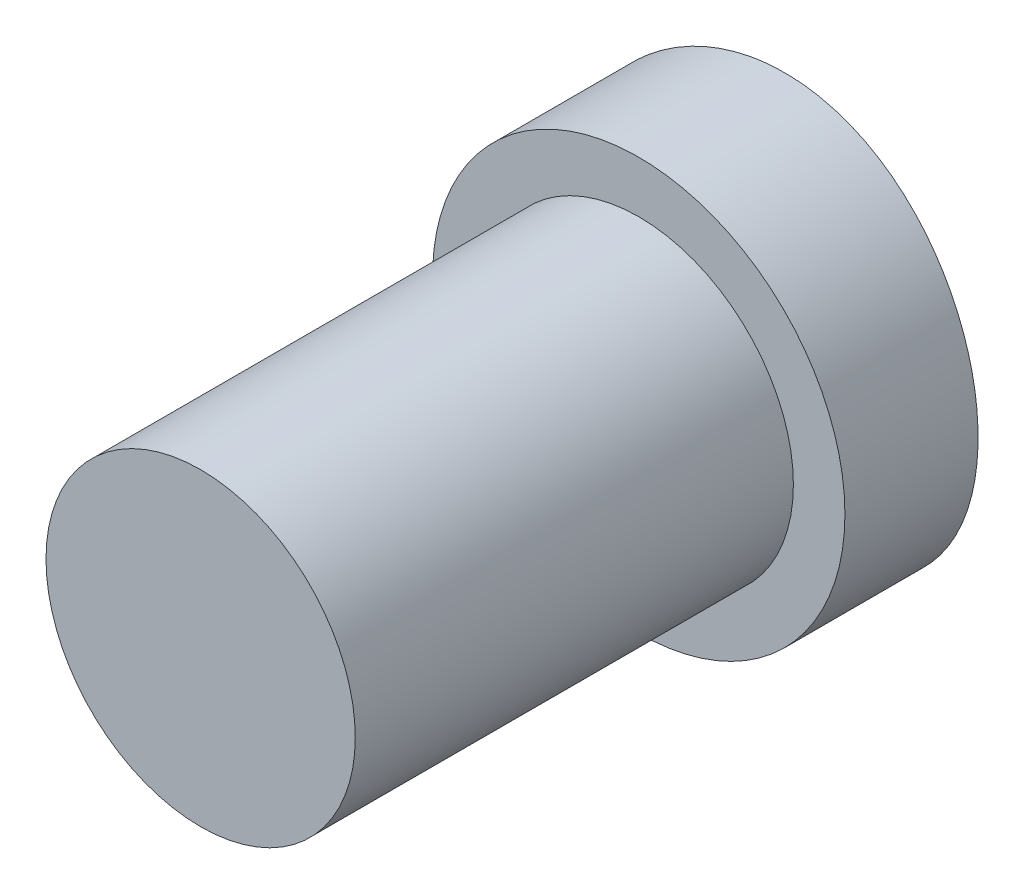
ISO-10303-21;
HEADER;
FILE_DESCRIPTION(('STEP AP214'),'2;1');
FILE_NAME('part.step','',(''),(''),'','','');
FILE_SCHEMA(('AUTOMOTIVE_DESIGN { 1 0 10303 214 1 1 1 1 }'));
ENDSEC;
DATA;
#1=APPLICATION_CONTEXT('core data for automotive mechanical design processes');
#2=APPLICATION_PROTOCOL_DEFINITION('international standard','automotive_design',2000,#1);
#3=PRODUCT_CONTEXT('',#1,'mechanical');
#4=PRODUCT('Part','Part','',(#3));
#5=PRODUCT_RELATED_PRODUCT_CATEGORY('part','',(#4));
#6=PRODUCT_DEFINITION_FORMATION('','',#4);
#7=PRODUCT_DEFINITION_CONTEXT('part definition',#1,'design');
#8=PRODUCT_DEFINITION('design','',#6,#7);
#9=PRODUCT_DEFINITION_SHAPE('','',#8);
#10=(LENGTH_UNIT() NAMED_UNIT(*) SI_UNIT(.MILLI.,.METRE.));
#11=(NAMED_UNIT(*) PLANE_ANGLE_UNIT() SI_UNIT($,.RADIAN.));
#12=(NAMED_UNIT(*) SI_UNIT($,.STERADIAN.) SOLID_ANGLE_UNIT());
#13=UNCERTAINTY_MEASURE_WITH_UNIT(LENGTH_MEASURE(1.E-05),#10,'distance_accuracy_value','');
#14=(GEOMETRIC_REPRESENTATION_CONTEXT(3) GLOBAL_UNCERTAINTY_ASSIGNED_CONTEXT((#13)) GLOBAL_UNIT_ASSIGNED_CONTEXT((#10,
#11,#12)) REPRESENTATION_CONTEXT('',''));
#15=CARTESIAN_POINT('',(0.,0.,0.));
#16=DIRECTION('',(0.,0.,1.));
#17=DIRECTION('',(1.,0.,0.));
#18=AXIS2_PLACEMENT_3D('',#15,#16,#17);
#19=CARTESIAN_POINT('',(0.,0.,4.25));
#20=DIRECTION('',(0.,0.,-1.));
#21=DIRECTION('',(-1.,0.,0.));
#22=AXIS2_PLACEMENT_3D('',#19,#20,#21);
#23=CYLINDRICAL_SURFACE('',#22,6.);
#24=CARTESIAN_POINT('',(0.,0.,4.25));
#25=DIRECTION('',(0.,0.,1.));
#26=DIRECTION('',(1.,0.,0.));
#27=AXIS2_PLACEMENT_3D('',#24,#25,#26);
#28=CIRCLE('',#27,6.);
#29=CARTESIAN_POINT('',(6.,0.,4.25));
#30=VERTEX_POINT('',#29);
#31=EDGE_CURVE('E82',#30,#30,#28,.T.);
#32=ORIENTED_EDGE('',*,*,#31,.F.);
#33=EDGE_LOOP('',(#32));
#34=FACE_BOUND('',#33,.T.);
#35=CARTESIAN_POINT('',(-0.529637426695832,-5.9765779670513,0.));
#36=CARTESIAN_POINT('',(-0.697299749020259,-5.96173874367267,0.00184627888821837));
#37=CARTESIAN_POINT('',(-0.864319494212486,-5.9398091739458,0.0045831043169606));
#38=CARTESIAN_POINT('',(-1.19588083431591,-5.88201702240622,0.0117228805096081));
#39=CARTESIAN_POINT('',(-1.36042263690977,-5.84615561508341,0.0161256908258704));
#40=CARTESIAN_POINT('',(-1.68570095536524,-5.76078761110217,0.0264776378324489));
#41=CARTESIAN_POINT('',(-1.84644111367921,-5.71129470223209,0.0324252230297163));
#42=CARTESIAN_POINT('',(-2.16315043363023,-5.59901809732282,0.04569859685567));
#43=CARTESIAN_POINT('',(-2.31911961126829,-5.53623444586398,0.0530243808615387));
#44=CARTESIAN_POINT('',(-2.62520842764486,-5.39782336650531,0.0688499336656704));
#45=CARTESIAN_POINT('',(-2.77532743695794,-5.32219456124744,0.0773498283430128));
#46=CARTESIAN_POINT('',(-3.06870562749703,-5.15861063421861,0.0952878999150453));
#47=CARTESIAN_POINT('',(-3.21196225161304,-5.07065096484122,0.104726422599587));
#48=CARTESIAN_POINT('',(-3.49049911883454,-4.88309263157436,0.124270529808491));
#49=CARTESIAN_POINT('',(-3.62578292551855,-4.78349922784735,0.134375811966825));
#50=CARTESIAN_POINT('',(-3.887557533959,-4.57330124795442,0.154978658162459));
#51=CARTESIAN_POINT('',(-4.0140450560283,-4.46269260175156,0.165476366296186));
#52=CARTESIAN_POINT('',(-4.25785060291722,-4.23073841181112,0.186614876559829));
#53=CARTESIAN_POINT('',(-4.37512435335369,-4.10934636676976,0.197256112136595));
#54=CARTESIAN_POINT('',(-4.59908125670593,-3.85706020534983,0.218337660563537));
#55=CARTESIAN_POINT('',(-4.70576047207851,-3.72616258720771,0.228777897557494));
#56=CARTESIAN_POINT('',(-4.90770362243647,-3.45585022990514,0.249154804529889));
#57=CARTESIAN_POINT('',(-5.00297022036496,-3.31643748911364,0.259091591666426));
#58=CARTESIAN_POINT('',(-5.18147256609491,-3.02998868103063,0.278184781429977));
#59=CARTESIAN_POINT('',(-5.26470387201021,-2.88294982622057,0.287340895423584));
#60=CARTESIAN_POINT('',(-5.41854427953499,-2.58223168438578,0.304611986503086));
#61=CARTESIAN_POINT('',(-5.48914522087365,-2.42854818339892,0.312726289543272));
#62=CARTESIAN_POINT('',(-5.61716749036869,-2.11565889421006,0.327675692036333));
#63=CARTESIAN_POINT('',(-5.67458392405817,-1.95645108039019,0.334510316262507));
#64=CARTESIAN_POINT('',(-5.77575528388416,-1.63377621474279,0.346695490092723));
#65=CARTESIAN_POINT('',(-5.81951648551284,-1.47031115693701,0.35204672128845));
#66=CARTESIAN_POINT('',(-5.89310057056222,-1.1401680529165,0.361115360774109));
#67=CARTESIAN_POINT('',(-5.92291833701192,-0.973488850500869,0.36483216923272));
#68=CARTESIAN_POINT('',(-5.96820537173291,-0.639328105522975,0.370499595098223));
#69=CARTESIAN_POINT('',(-5.98377263936863,-0.471860127096247,0.372462273250455));
#70=CARTESIAN_POINT('',(-6.00081272683844,-0.136180691702472,0.374612825889777));
#71=CARTESIAN_POINT('',(-6.00228035814908,0.0320310161704776,0.374800047026332));
#72=CARTESIAN_POINT('',(-5.98543995414297,0.535835300723561,0.372668567542444));
#73=CARTESIAN_POINT('',(-5.94593863898624,0.870968571136869,0.36766306767953));
#74=CARTESIAN_POINT('',(-5.81177033944227,1.52825628746833,0.351067070460233));
#75=CARTESIAN_POINT('',(-5.71732108330977,1.850456623182,0.339502567315694));
#76=CARTESIAN_POINT('',(-5.4761944514525,2.47449539565843,0.311122842473754));
#77=CARTESIAN_POINT('',(-5.32951379222412,2.77633255087977,0.294307290679725));
#78=CARTESIAN_POINT('',(-4.98725804940486,3.35263324429608,0.257216558221169));
#79=CARTESIAN_POINT('',(-4.79144762909404,3.62695586740277,0.236924879394803));
#80=CARTESIAN_POINT('',(-4.35679309305538,4.13897560857682,0.195211626285175));
#81=CARTESIAN_POINT('',(-4.11794881755311,4.37667259065586,0.173790047807073));
#82=CARTESIAN_POINT('',(-3.60224044051181,4.81020295445595,0.132070052733356));
#83=CARTESIAN_POINT('',(-3.32514964277028,5.00576744734914,0.11177942930605));
#84=CARTESIAN_POINT('',(-2.74187134279336,5.34755358451223,0.07475378055608));
#85=CARTESIAN_POINT('',(-2.43569119219378,5.49378765357356,0.0580178603087284));
#86=CARTESIAN_POINT('',(-1.8642688817929,5.70954283989778,0.0326971317185251));
#87=CARTESIAN_POINT('',(-1.60258165393208,5.78843578153665,0.0231614474962515));
#88=CARTESIAN_POINT('',(-1.2039692704405,5.87954595034236,0.0120254027328325));
#89=CARTESIAN_POINT('',(-1.07008914856499,5.90537741892147,0.00884135123715945));
#90=CARTESIAN_POINT('',(-0.800836589813039,5.94787685498124,0.00357864783826476));
#91=CARTESIAN_POINT('',(-0.665463893134765,5.96454320062446,0.00150019158056433));
#92=CARTESIAN_POINT('',(-0.529637426695832,5.9765779670513,0.));
#93=B_SPLINE_CURVE_WITH_KNOTS('',3,(#35,#36,#37,#38,#39,#40,#41,#42,#43,#44,#45,#46,#47,#48,#49,
#50,#51,#52,#53,#54,#55,#56,#57,#58,#59,#60,#61,#62,#63,#64,#65,#66,#67,#68,#69,#70,#71,#72,#73,
#74,#75,#76,#77,#78,#79,#80,#81,#82,#83,#84,#85,#86,#87,#88,#89,#90,#91,#92),.UNSPECIFIED.,.F.,
.F.,(4,2,2,2,2,2,2,2,2,2,2,2,2,2,2,2,2,2,2,2,2,2,2,2,2,2,2,2,4),(0.,0.504825171256516,
1.00960779367883,1.51388538553514,2.01816128595054,2.5224912929571,3.02700778792387,
3.5312970436747,4.03577332619375,4.54254177692136,5.04949787281024,5.55633544763132,
6.06335960703128,6.57071017257683,7.07824877779422,7.58555379038862,8.09304482828886,
8.59701908923331,9.10117880050351,10.108387713668,11.1116325389998,12.1149404440029,
13.1231492487514,14.1313617968153,15.1458297046725,16.1600419086734,16.9778425219701,
17.3867173694619,17.7956645471702),.UNSPECIFIED.);
#94=CARTESIAN_POINT('',(-0.529637426695832,-5.9765779670513,0.));
#95=VERTEX_POINT('',#94);
#96=CARTESIAN_POINT('',(-0.529637426695832,5.9765779670513,0.));
#97=VERTEX_POINT('',#96);
#98=EDGE_CURVE('E62',#95,#97,#93,.T.);
#99=ORIENTED_EDGE('',*,*,#98,.F.);
#100=CARTESIAN_POINT('',(0.,0.,0.));
#101=DIRECTION('',(0.,0.,1.));
#102=DIRECTION('',(1.,0.,0.));
#103=AXIS2_PLACEMENT_3D('',#100,#101,#102);
#104=CIRCLE('',#103,6.);
#105=CARTESIAN_POINT('',(0.529637426695832,-5.9765779670513,0.));
#106=VERTEX_POINT('',#105);
#107=EDGE_CURVE('E77',#95,#106,#104,.T.);
#108=ORIENTED_EDGE('',*,*,#107,.T.);
#109=CARTESIAN_POINT('',(0.529637426695832,5.9765779670513,0.));
#110=CARTESIAN_POINT('',(0.697299749020259,5.96173874367267,0.00184627888821837));
#111=CARTESIAN_POINT('',(0.864319494212486,5.9398091739458,0.0045831043169606));
#112=CARTESIAN_POINT('',(1.19588083431591,5.88201702240622,0.0117228805096081));
#113=CARTESIAN_POINT('',(1.36042263690977,5.84615561508341,0.0161256908258704));
#114=CARTESIAN_POINT('',(1.68570095536524,5.76078761110217,0.0264776378324489));
#115=CARTESIAN_POINT('',(1.84644111367921,5.71129470223209,0.0324252230297163));
#116=CARTESIAN_POINT('',(2.16315043363023,5.59901809732282,0.04569859685567));
#117=CARTESIAN_POINT('',(2.31911961126829,5.53623444586398,0.0530243808615387));
#118=CARTESIAN_POINT('',(2.62520842764486,5.39782336650531,0.0688499336656704));
#119=CARTESIAN_POINT('',(2.77532743695794,5.32219456124744,0.0773498283430128));
#120=CARTESIAN_POINT('',(3.06870562749703,5.15861063421861,0.0952878999150453));
#121=CARTESIAN_POINT('',(3.21196225161304,5.07065096484122,0.104726422599587));
#122=CARTESIAN_POINT('',(3.49049911883454,4.88309263157436,0.124270529808491));
#123=CARTESIAN_POINT('',(3.62578292551855,4.78349922784735,0.134375811966825));
#124=CARTESIAN_POINT('',(3.887557533959,4.57330124795442,0.154978658162459));
#125=CARTESIAN_POINT('',(4.0140450560283,4.46269260175156,0.165476366296186));
#126=CARTESIAN_POINT('',(4.25785060291722,4.23073841181112,0.186614876559829));
#127=CARTESIAN_POINT('',(4.37512435335369,4.10934636676976,0.197256112136595));
#128=CARTESIAN_POINT('',(4.59908125670593,3.85706020534983,0.218337660563537));
#129=CARTESIAN_POINT('',(4.70576047207851,3.72616258720771,0.228777897557494));
#130=CARTESIAN_POINT('',(4.90770362243647,3.45585022990514,0.249154804529889));
#131=CARTESIAN_POINT('',(5.00297022036496,3.31643748911364,0.259091591666426));
#132=CARTESIAN_POINT('',(5.18147256609491,3.02998868103063,0.278184781429977));
#133=CARTESIAN_POINT('',(5.26470387201021,2.88294982622057,0.287340895423584));
#134=CARTESIAN_POINT('',(5.41854427953499,2.58223168438578,0.304611986503086));
#135=CARTESIAN_POINT('',(5.48914522087365,2.42854818339892,0.312726289543272));
#136=CARTESIAN_POINT('',(5.61716749036869,2.11565889421006,0.327675692036333));
#137=CARTESIAN_POINT('',(5.67458392405817,1.95645108039019,0.334510316262507));
#138=CARTESIAN_POINT('',(5.77575528388416,1.63377621474279,0.346695490092723));
#139=CARTESIAN_POINT('',(5.81951648551284,1.47031115693701,0.35204672128845));
#140=CARTESIAN_POINT('',(5.89310057056222,1.1401680529165,0.361115360774109));
#141=CARTESIAN_POINT('',(5.92291833701192,0.973488850500869,0.36483216923272));
#142=CARTESIAN_POINT('',(5.96820537173291,0.639328105522975,0.370499595098223));
#143=CARTESIAN_POINT('',(5.98377263936863,0.471860127096247,0.372462273250455));
#144=CARTESIAN_POINT('',(6.00081272683844,0.136180691702472,0.374612825889777));
#145=CARTESIAN_POINT('',(6.00228035814908,-0.0320310161704776,0.374800047026332));
#146=CARTESIAN_POINT('',(5.98543995414297,-0.535835300723561,0.372668567542444));
#147=CARTESIAN_POINT('',(5.94593863898624,-0.870968571136869,0.36766306767953));
#148=CARTESIAN_POINT('',(5.81177033944227,-1.52825628746833,0.351067070460233));
#149=CARTESIAN_POINT('',(5.71732108330977,-1.850456623182,0.339502567315694));
#150=CARTESIAN_POINT('',(5.4761944514525,-2.47449539565843,0.311122842473754));
#151=CARTESIAN_POINT('',(5.32951379222412,-2.77633255087977,0.294307290679725));
#152=CARTESIAN_POINT('',(4.98725804940486,-3.35263324429608,0.257216558221169));
#153=CARTESIAN_POINT('',(4.79144762909404,-3.62695586740277,0.236924879394803));
#154=CARTESIAN_POINT('',(4.35679309305538,-4.13897560857682,0.195211626285175));
#155=CARTESIAN_POINT('',(4.11794881755311,-4.37667259065586,0.173790047807073));
#156=CARTESIAN_POINT('',(3.60224044051181,-4.81020295445595,0.132070052733356));
#157=CARTESIAN_POINT('',(3.32514964277028,-5.00576744734914,0.11177942930605));
#158=CARTESIAN_POINT('',(2.74187134279336,-5.34755358451223,0.07475378055608));
#159=CARTESIAN_POINT('',(2.43569119219378,-5.49378765357356,0.0580178603087284));
#160=CARTESIAN_POINT('',(1.8642688817929,-5.70954283989778,0.0326971317185251));
#161=CARTESIAN_POINT('',(1.60258165393208,-5.78843578153665,0.0231614474962515));
#162=CARTESIAN_POINT('',(1.2039692704405,-5.87954595034236,0.0120254027328325));
#163=CARTESIAN_POINT('',(1.07008914856499,-5.90537741892147,0.00884135123715945));
#164=CARTESIAN_POINT('',(0.800836589813039,-5.94787685498124,0.00357864783826476));
#165=CARTESIAN_POINT('',(0.665463893134765,-5.96454320062446,0.00150019158056433));
#166=CARTESIAN_POINT('',(0.529637426695832,-5.9765779670513,0.));
#167=B_SPLINE_CURVE_WITH_KNOTS('',3,(#109,#110,#111,#112,#113,#114,#115,#116,#117,#118,#119,
#120,#121,#122,#123,#124,#125,#126,#127,#128,#129,#130,#131,#132,#133,#134,#135,#136,#137,#138,
#139,#140,#141,#142,#143,#144,#145,#146,#147,#148,#149,#150,#151,#152,#153,#154,#155,#156,#157,
#158,#159,#160,#161,#162,#163,#164,#165,#166),.UNSPECIFIED.,.F.,.F.,(4,2,2,2,2,2,2,2,2,2,2,2,2,
2,2,2,2,2,2,2,2,2,2,2,2,2,2,2,4),(0.,0.504825171256516,1.00960779367883,1.51388538553514,
2.01816128595054,2.5224912929571,3.02700778792387,3.5312970436747,4.03577332619375,
4.54254177692136,5.04949787281024,5.55633544763132,6.06335960703128,6.57071017257683,
7.07824877779422,7.58555379038862,8.09304482828886,8.59701908923331,9.10117880050351,
10.108387713668,11.1116325389998,12.1149404440029,13.1231492487514,14.1313617968153,
15.1458297046725,16.1600419086734,16.9778425219701,17.3867173694619,17.7956645471702),.UNSPECIFIED.);
#168=CARTESIAN_POINT('',(0.529637426695832,5.9765779670513,0.));
#169=VERTEX_POINT('',#168);
#170=EDGE_CURVE('E56',#169,#106,#167,.T.);
#171=ORIENTED_EDGE('',*,*,#170,.F.);
#172=EDGE_CURVE('E76',#169,#97,#104,.T.);
#173=ORIENTED_EDGE('',*,*,#172,.T.);
#174=EDGE_LOOP('',(#99,#108,#171,#173));
#175=FACE_BOUND('',#174,.T.);
#176=ADVANCED_FACE('F41',(#34,#175),#23,.T.);
#177=CARTESIAN_POINT('',(0.,0.,0.));
#178=DIRECTION('',(0.,0.,1.));
#179=DIRECTION('',(1.,0.,0.));
#180=AXIS2_PLACEMENT_3D('',#177,#178,#179);
#181=PLANE('',#180);
#182=DIRECTION('',(0.,1.,0.));
#183=VECTOR('',#182,1.);
#184=CARTESIAN_POINT('',(-0.529637426695832,-6.,0.));
#185=LINE('',#184,#183);
#186=EDGE_CURVE('E11',#97,#95,#185,.F.);
#187=ORIENTED_EDGE('',*,*,#186,.F.);
#188=ORIENTED_EDGE('',*,*,#172,.F.);
#189=DIRECTION('',(0.,1.,0.));
#190=VECTOR('',#189,1.);
#191=CARTESIAN_POINT('',(0.529637426695832,-6.,0.));
#192=LINE('',#191,#190);
#193=EDGE_CURVE('E50',#106,#169,#192,.T.);
#194=ORIENTED_EDGE('',*,*,#193,.F.);
#195=ORIENTED_EDGE('',*,*,#107,.F.);
#196=EDGE_LOOP('',(#187,#188,#194,#195));
#197=FACE_BOUND('',#196,.T.);
#198=ADVANCED_FACE('F80',(#197),#181,.F.);
#199=CARTESIAN_POINT('',(0.,0.,17.));
#200=DIRECTION('',(0.,0.,-1.));
#201=DIRECTION('',(-1.,0.,0.));
#202=AXIS2_PLACEMENT_3D('',#199,#200,#201);
#203=CYLINDRICAL_SURFACE('',#202,4.5);
#204=CARTESIAN_POINT('',(0.,0.,4.25));
#205=DIRECTION('',(0.,0.,1.));
#206=DIRECTION('',(1.,0.,0.));
#207=AXIS2_PLACEMENT_3D('',#204,#205,#206);
#208=CIRCLE('',#207,4.5);
#209=CARTESIAN_POINT('',(4.5,0.,4.25));
#210=VERTEX_POINT('',#209);
#211=EDGE_CURVE('E88',#210,#210,#208,.T.);
#212=ORIENTED_EDGE('',*,*,#211,.T.);
#213=EDGE_LOOP('',(#212));
#214=FACE_BOUND('',#213,.T.);
#215=CARTESIAN_POINT('',(0.,0.,17.));
#216=DIRECTION('',(0.,0.,1.));
#217=DIRECTION('',(1.,0.,0.));
#218=AXIS2_PLACEMENT_3D('',#215,#216,#217);
#219=CIRCLE('',#218,4.5);
#220=CARTESIAN_POINT('',(4.5,0.,17.));
#221=VERTEX_POINT('',#220);
#222=EDGE_CURVE('E73',#221,#221,#219,.T.);
#223=ORIENTED_EDGE('',*,*,#222,.F.);
#224=EDGE_LOOP('',(#223));
#225=FACE_BOUND('',#224,.T.);
#226=ADVANCED_FACE('F43',(#214,#225),#203,.T.);
#227=CARTESIAN_POINT('',(0.,0.,17.));
#228=DIRECTION('',(0.,0.,1.));
#229=DIRECTION('',(1.,0.,0.));
#230=AXIS2_PLACEMENT_3D('',#227,#228,#229);
#231=PLANE('',#230);
#232=ORIENTED_EDGE('',*,*,#222,.T.);
#233=EDGE_LOOP('',(#232));
#234=FACE_BOUND('',#233,.T.);
#235=ADVANCED_FACE('F95',(#234),#231,.T.);
#236=CARTESIAN_POINT('',(0.,0.,4.25));
#237=DIRECTION('',(0.,0.,1.));
#238=DIRECTION('',(1.,0.,0.));
#239=AXIS2_PLACEMENT_3D('',#236,#237,#238);
#240=PLANE('',#239);
#241=ORIENTED_EDGE('',*,*,#31,.T.);
#242=EDGE_LOOP('',(#241));
#243=FACE_BOUND('',#242,.T.);
#244=ORIENTED_EDGE('',*,*,#211,.F.);
#245=EDGE_LOOP('',(#244));
#246=FACE_BOUND('',#245,.T.);
#247=ADVANCED_FACE('F103',(#243,#246),#240,.T.);
#248=CARTESIAN_POINT('',(0.,-6.,47.8754895536328));
#249=DIRECTION('',(0.,1.,0.));
#250=DIRECTION('',(0.,0.,1.));
#251=AXIS2_PLACEMENT_3D('',#248,#249,#250);
#252=CYLINDRICAL_SURFACE('',#251,47.878419103013);
#253=ORIENTED_EDGE('',*,*,#170,.T.);
#254=ORIENTED_EDGE('',*,*,#193,.T.);
#255=EDGE_LOOP('',(#253,#254));
#256=FACE_BOUND('',#255,.T.);
#257=ADVANCED_FACE('F67',(#256),#252,.T.);
#258=CARTESIAN_POINT('',(0.,-6.,47.8754895536328));
#259=DIRECTION('',(0.,1.,0.));
#260=DIRECTION('',(0.,0.,1.));
#261=AXIS2_PLACEMENT_3D('',#258,#259,#260);
#262=CYLINDRICAL_SURFACE('',#261,47.878419103013);
#263=ORIENTED_EDGE('',*,*,#98,.T.);
#264=ORIENTED_EDGE('',*,*,#186,.T.);
#265=EDGE_LOOP('',(#263,#264));
#266=FACE_BOUND('',#265,.T.);
#267=ADVANCED_FACE('F127',(#266),#262,.T.);
#268=CLOSED_SHELL('',(#176,#198,#226,#235,#247,#257,#267));
#269=MANIFOLD_SOLID_BREP('B2',#268);
#270=ADVANCED_BREP_SHAPE_REPRESENTATION('',(#18,#269),#14);
#271=SHAPE_DEFINITION_REPRESENTATION(#9,#270);
ENDSEC;
END-ISO-10303-21;
